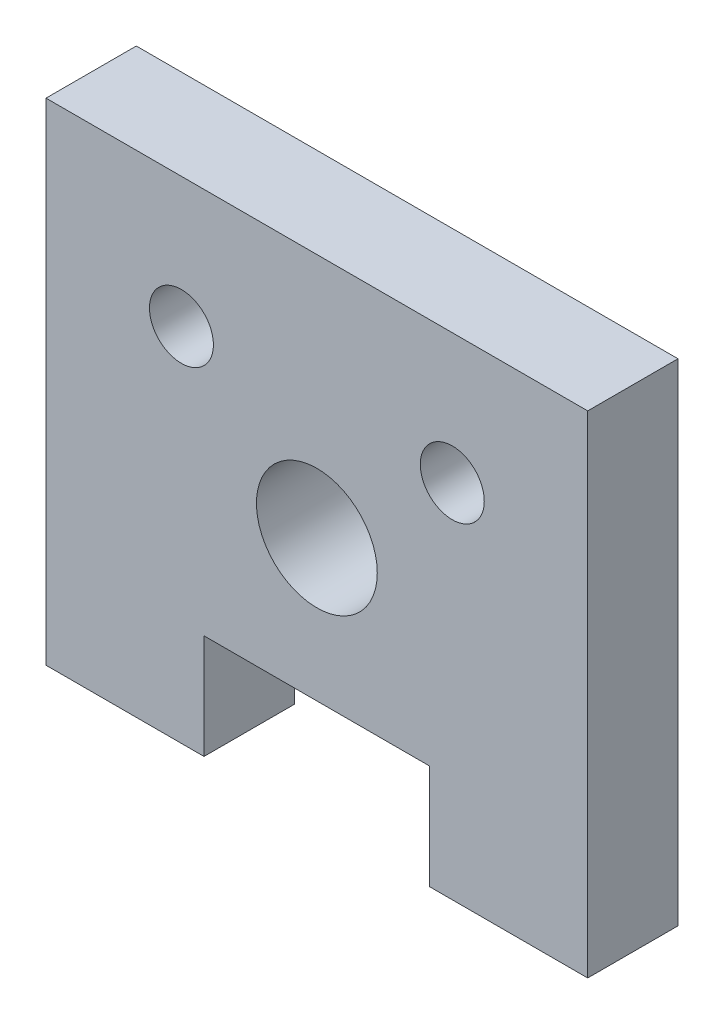
ISO-10303-21;
HEADER;
FILE_DESCRIPTION(('STEP AP214'),'2;1');
FILE_NAME('part.step','',(''),(''),'','','');
FILE_SCHEMA(('AUTOMOTIVE_DESIGN { 1 0 10303 214 1 1 1 1 }'));
ENDSEC;
DATA;
#1=APPLICATION_CONTEXT('core data for automotive mechanical design processes');
#2=APPLICATION_PROTOCOL_DEFINITION('international standard','automotive_design',2000,#1);
#3=PRODUCT_CONTEXT('',#1,'mechanical');
#4=PRODUCT('Part','Part','',(#3));
#5=PRODUCT_RELATED_PRODUCT_CATEGORY('part','',(#4));
#6=PRODUCT_DEFINITION_FORMATION('','',#4);
#7=PRODUCT_DEFINITION_CONTEXT('part definition',#1,'design');
#8=PRODUCT_DEFINITION('design','',#6,#7);
#9=PRODUCT_DEFINITION_SHAPE('','',#8);
#10=(LENGTH_UNIT() NAMED_UNIT(*) SI_UNIT(.MILLI.,.METRE.));
#11=(NAMED_UNIT(*) PLANE_ANGLE_UNIT() SI_UNIT($,.RADIAN.));
#12=(NAMED_UNIT(*) SI_UNIT($,.STERADIAN.) SOLID_ANGLE_UNIT());
#13=UNCERTAINTY_MEASURE_WITH_UNIT(LENGTH_MEASURE(1.E-05),#10,'distance_accuracy_value','');
#14=(GEOMETRIC_REPRESENTATION_CONTEXT(3) GLOBAL_UNCERTAINTY_ASSIGNED_CONTEXT((#13)) GLOBAL_UNIT_ASSIGNED_CONTEXT((#10,
#11,#12)) REPRESENTATION_CONTEXT('',''));
#15=CARTESIAN_POINT('',(0.,0.,0.));
#16=DIRECTION('',(0.,0.,1.));
#17=DIRECTION('',(1.,0.,0.));
#18=AXIS2_PLACEMENT_3D('',#15,#16,#17);
#19=CARTESIAN_POINT('',(0.,0.,12.7));
#20=DIRECTION('',(0.,0.,1.));
#21=DIRECTION('',(1.,0.,0.));
#22=AXIS2_PLACEMENT_3D('',#19,#20,#21);
#23=PLANE('',#22);
#24=CARTESIAN_POINT('',(19.05,16.256,12.7));
#25=DIRECTION('',(0.,0.,1.));
#26=DIRECTION('',(1.,0.,0.));
#27=AXIS2_PLACEMENT_3D('',#24,#25,#26);
#28=CIRCLE('',#27,4.5);
#29=CARTESIAN_POINT('',(23.55,16.256,12.7));
#30=VERTEX_POINT('',#29);
#31=EDGE_CURVE('E181',#30,#30,#28,.T.);
#32=ORIENTED_EDGE('',*,*,#31,.F.);
#33=EDGE_LOOP('',(#32));
#34=FACE_BOUND('',#33,.T.);
#35=DIRECTION('',(0.,-1.,0.));
#36=VECTOR('',#35,1.);
#37=CARTESIAN_POINT('',(-38.1,-34.544,12.7));
#38=LINE('',#37,#36);
#39=CARTESIAN_POINT('',(-38.1,34.544,12.7));
#40=VERTEX_POINT('',#39);
#41=CARTESIAN_POINT('',(-38.1,-34.544,12.7));
#42=VERTEX_POINT('',#41);
#43=EDGE_CURVE('E144',#40,#42,#38,.T.);
#44=ORIENTED_EDGE('',*,*,#43,.T.);
#45=DIRECTION('',(1.,0.,0.));
#46=VECTOR('',#45,1.);
#47=CARTESIAN_POINT('',(-15.875,-34.544,12.7));
#48=LINE('',#47,#46);
#49=CARTESIAN_POINT('',(-15.875,-34.544,12.7));
#50=VERTEX_POINT('',#49);
#51=EDGE_CURVE('E92',#42,#50,#48,.T.);
#52=ORIENTED_EDGE('',*,*,#51,.T.);
#53=DIRECTION('',(0.,1.,0.));
#54=VECTOR('',#53,1.);
#55=CARTESIAN_POINT('',(-15.875,-34.544,12.7));
#56=LINE('',#55,#54);
#57=CARTESIAN_POINT('',(-15.875,-19.844,12.7));
#58=VERTEX_POINT('',#57);
#59=EDGE_CURVE('E159',#50,#58,#56,.T.);
#60=ORIENTED_EDGE('',*,*,#59,.T.);
#61=DIRECTION('',(1.,0.,0.));
#62=VECTOR('',#61,1.);
#63=CARTESIAN_POINT('',(-15.875,-19.844,12.7));
#64=LINE('',#63,#62);
#65=CARTESIAN_POINT('',(15.875,-19.844,12.7));
#66=VERTEX_POINT('',#65);
#67=EDGE_CURVE('E172',#58,#66,#64,.T.);
#68=ORIENTED_EDGE('',*,*,#67,.T.);
#69=DIRECTION('',(0.,-1.,0.));
#70=VECTOR('',#69,1.);
#71=CARTESIAN_POINT('',(15.875,-19.844,12.7));
#72=LINE('',#71,#70);
#73=CARTESIAN_POINT('',(15.875,-34.544,12.7));
#74=VERTEX_POINT('',#73);
#75=EDGE_CURVE('E111',#66,#74,#72,.T.);
#76=ORIENTED_EDGE('',*,*,#75,.T.);
#77=DIRECTION('',(1.,0.,0.));
#78=VECTOR('',#77,1.);
#79=CARTESIAN_POINT('',(38.1,-34.544,12.7));
#80=LINE('',#79,#78);
#81=CARTESIAN_POINT('',(38.1,-34.544,12.7));
#82=VERTEX_POINT('',#81);
#83=EDGE_CURVE('E105',#74,#82,#80,.T.);
#84=ORIENTED_EDGE('',*,*,#83,.T.);
#85=DIRECTION('',(0.,1.,0.));
#86=VECTOR('',#85,1.);
#87=CARTESIAN_POINT('',(38.1,-34.544,12.7));
#88=LINE('',#87,#86);
#89=CARTESIAN_POINT('',(38.1,34.544,12.7));
#90=VERTEX_POINT('',#89);
#91=EDGE_CURVE('E109',#82,#90,#88,.T.);
#92=ORIENTED_EDGE('',*,*,#91,.T.);
#93=DIRECTION('',(-1.,0.,0.));
#94=VECTOR('',#93,1.);
#95=CARTESIAN_POINT('',(38.1,34.544,12.7));
#96=LINE('',#95,#94);
#97=EDGE_CURVE('E49',#90,#40,#96,.T.);
#98=ORIENTED_EDGE('',*,*,#97,.T.);
#99=EDGE_LOOP('',(#44,#52,#60,#68,#76,#84,#92,#98));
#100=FACE_BOUND('',#99,.T.);
#101=CARTESIAN_POINT('',(0.,0.,12.7));
#102=DIRECTION('',(0.,0.,1.));
#103=DIRECTION('',(1.,0.,0.));
#104=AXIS2_PLACEMENT_3D('',#101,#102,#103);
#105=CIRCLE('',#104,8.5);
#106=CARTESIAN_POINT('',(8.5,0.,12.7));
#107=VERTEX_POINT('',#106);
#108=EDGE_CURVE('E133',#107,#107,#105,.T.);
#109=ORIENTED_EDGE('',*,*,#108,.F.);
#110=EDGE_LOOP('',(#109));
#111=FACE_BOUND('',#110,.T.);
#112=CARTESIAN_POINT('',(-19.05,16.256,12.7));
#113=DIRECTION('',(0.,0.,1.));
#114=DIRECTION('',(1.,0.,0.));
#115=AXIS2_PLACEMENT_3D('',#112,#113,#114);
#116=CIRCLE('',#115,4.5);
#117=CARTESIAN_POINT('',(-14.55,16.256,12.7));
#118=VERTEX_POINT('',#117);
#119=EDGE_CURVE('E187',#118,#118,#116,.T.);
#120=ORIENTED_EDGE('',*,*,#119,.F.);
#121=EDGE_LOOP('',(#120));
#122=FACE_BOUND('',#121,.T.);
#123=ADVANCED_FACE('F32',(#34,#100,#111,#122),#23,.T.);
#124=CARTESIAN_POINT('',(0.,0.,0.));
#125=DIRECTION('',(0.,0.,1.));
#126=DIRECTION('',(1.,0.,0.));
#127=AXIS2_PLACEMENT_3D('',#124,#125,#126);
#128=PLANE('',#127);
#129=DIRECTION('',(0.,-1.,0.));
#130=VECTOR('',#129,1.);
#131=CARTESIAN_POINT('',(-38.1,-34.544,0.));
#132=LINE('',#131,#130);
#133=CARTESIAN_POINT('',(-38.1,34.544,0.));
#134=VERTEX_POINT('',#133);
#135=CARTESIAN_POINT('',(-38.1,-34.544,0.));
#136=VERTEX_POINT('',#135);
#137=EDGE_CURVE('E129',#134,#136,#132,.T.);
#138=ORIENTED_EDGE('',*,*,#137,.F.);
#139=DIRECTION('',(-1.,0.,0.));
#140=VECTOR('',#139,1.);
#141=CARTESIAN_POINT('',(38.1,34.544,0.));
#142=LINE('',#141,#140);
#143=CARTESIAN_POINT('',(38.1,34.544,0.));
#144=VERTEX_POINT('',#143);
#145=EDGE_CURVE('E84',#144,#134,#142,.T.);
#146=ORIENTED_EDGE('',*,*,#145,.F.);
#147=DIRECTION('',(0.,1.,0.));
#148=VECTOR('',#147,1.);
#149=CARTESIAN_POINT('',(38.1,-34.544,0.));
#150=LINE('',#149,#148);
#151=CARTESIAN_POINT('',(38.1,-34.544,0.));
#152=VERTEX_POINT('',#151);
#153=EDGE_CURVE('E78',#152,#144,#150,.T.);
#154=ORIENTED_EDGE('',*,*,#153,.F.);
#155=DIRECTION('',(1.,0.,0.));
#156=VECTOR('',#155,1.);
#157=CARTESIAN_POINT('',(38.1,-34.544,0.));
#158=LINE('',#157,#156);
#159=CARTESIAN_POINT('',(15.875,-34.544,0.));
#160=VERTEX_POINT('',#159);
#161=EDGE_CURVE('E119',#160,#152,#158,.T.);
#162=ORIENTED_EDGE('',*,*,#161,.F.);
#163=DIRECTION('',(0.,-1.,0.));
#164=VECTOR('',#163,1.);
#165=CARTESIAN_POINT('',(15.875,-19.844,0.));
#166=LINE('',#165,#164);
#167=CARTESIAN_POINT('',(15.875,-19.844,0.));
#168=VERTEX_POINT('',#167);
#169=EDGE_CURVE('E139',#168,#160,#166,.T.);
#170=ORIENTED_EDGE('',*,*,#169,.F.);
#171=DIRECTION('',(1.,0.,0.));
#172=VECTOR('',#171,1.);
#173=CARTESIAN_POINT('',(-15.875,-19.844,0.));
#174=LINE('',#173,#172);
#175=CARTESIAN_POINT('',(-15.875,-19.844,0.));
#176=VERTEX_POINT('',#175);
#177=EDGE_CURVE('E137',#176,#168,#174,.T.);
#178=ORIENTED_EDGE('',*,*,#177,.F.);
#179=DIRECTION('',(0.,1.,0.));
#180=VECTOR('',#179,1.);
#181=CARTESIAN_POINT('',(-15.875,-34.544,0.));
#182=LINE('',#181,#180);
#183=CARTESIAN_POINT('',(-15.875,-34.544,0.));
#184=VERTEX_POINT('',#183);
#185=EDGE_CURVE('E135',#184,#176,#182,.T.);
#186=ORIENTED_EDGE('',*,*,#185,.F.);
#187=DIRECTION('',(1.,0.,0.));
#188=VECTOR('',#187,1.);
#189=CARTESIAN_POINT('',(-15.875,-34.544,0.));
#190=LINE('',#189,#188);
#191=EDGE_CURVE('E132',#136,#184,#190,.T.);
#192=ORIENTED_EDGE('',*,*,#191,.F.);
#193=EDGE_LOOP('',(#138,#146,#154,#162,#170,#178,#186,#192));
#194=FACE_BOUND('',#193,.T.);
#195=CARTESIAN_POINT('',(0.,0.,0.));
#196=DIRECTION('',(0.,0.,1.));
#197=DIRECTION('',(1.,0.,0.));
#198=AXIS2_PLACEMENT_3D('',#195,#196,#197);
#199=CIRCLE('',#198,8.5);
#200=CARTESIAN_POINT('',(8.5,0.,0.));
#201=VERTEX_POINT('',#200);
#202=EDGE_CURVE('E178',#201,#201,#199,.T.);
#203=ORIENTED_EDGE('',*,*,#202,.T.);
#204=EDGE_LOOP('',(#203));
#205=FACE_BOUND('',#204,.T.);
#206=CARTESIAN_POINT('',(19.05,16.256,0.));
#207=DIRECTION('',(0.,0.,1.));
#208=DIRECTION('',(1.,0.,0.));
#209=AXIS2_PLACEMENT_3D('',#206,#207,#208);
#210=CIRCLE('',#209,4.5);
#211=CARTESIAN_POINT('',(23.55,16.256,0.));
#212=VERTEX_POINT('',#211);
#213=EDGE_CURVE('E184',#212,#212,#210,.T.);
#214=ORIENTED_EDGE('',*,*,#213,.T.);
#215=EDGE_LOOP('',(#214));
#216=FACE_BOUND('',#215,.T.);
#217=CARTESIAN_POINT('',(-19.05,16.256,0.));
#218=DIRECTION('',(0.,0.,1.));
#219=DIRECTION('',(1.,0.,0.));
#220=AXIS2_PLACEMENT_3D('',#217,#218,#219);
#221=CIRCLE('',#220,4.5);
#222=CARTESIAN_POINT('',(-14.55,16.256,0.));
#223=VERTEX_POINT('',#222);
#224=EDGE_CURVE('E190',#223,#223,#221,.T.);
#225=ORIENTED_EDGE('',*,*,#224,.T.);
#226=EDGE_LOOP('',(#225));
#227=FACE_BOUND('',#226,.T.);
#228=ADVANCED_FACE('F163',(#194,#205,#216,#227),#128,.F.);
#229=CARTESIAN_POINT('',(-38.1,-34.544,12.7));
#230=DIRECTION('',(1.,0.,0.));
#231=DIRECTION('',(0.,0.,-1.));
#232=AXIS2_PLACEMENT_3D('',#229,#230,#231);
#233=PLANE('',#232);
#234=ORIENTED_EDGE('',*,*,#137,.T.);
#235=DIRECTION('',(0.,0.,-1.));
#236=VECTOR('',#235,1.);
#237=CARTESIAN_POINT('',(-38.1,-34.544,12.7));
#238=LINE('',#237,#236);
#239=EDGE_CURVE('E11',#42,#136,#238,.T.);
#240=ORIENTED_EDGE('',*,*,#239,.F.);
#241=ORIENTED_EDGE('',*,*,#43,.F.);
#242=DIRECTION('',(0.,0.,-1.));
#243=VECTOR('',#242,1.);
#244=CARTESIAN_POINT('',(-38.1,34.544,12.7));
#245=LINE('',#244,#243);
#246=EDGE_CURVE('E125',#40,#134,#245,.T.);
#247=ORIENTED_EDGE('',*,*,#246,.T.);
#248=EDGE_LOOP('',(#234,#240,#241,#247));
#249=FACE_BOUND('',#248,.T.);
#250=ADVANCED_FACE('F34',(#249),#233,.F.);
#251=CARTESIAN_POINT('',(-15.875,-34.544,12.7));
#252=DIRECTION('',(0.,1.,0.));
#253=DIRECTION('',(0.,0.,1.));
#254=AXIS2_PLACEMENT_3D('',#251,#252,#253);
#255=PLANE('',#254);
#256=ORIENTED_EDGE('',*,*,#191,.T.);
#257=DIRECTION('',(0.,0.,-1.));
#258=VECTOR('',#257,1.);
#259=CARTESIAN_POINT('',(-15.875,-34.544,12.7));
#260=LINE('',#259,#258);
#261=EDGE_CURVE('E41',#50,#184,#260,.T.);
#262=ORIENTED_EDGE('',*,*,#261,.F.);
#263=ORIENTED_EDGE('',*,*,#51,.F.);
#264=ORIENTED_EDGE('',*,*,#239,.T.);
#265=EDGE_LOOP('',(#256,#262,#263,#264));
#266=FACE_BOUND('',#265,.T.);
#267=ADVANCED_FACE('F223',(#266),#255,.F.);
#268=CARTESIAN_POINT('',(-15.875,-34.544,12.7));
#269=DIRECTION('',(-1.,0.,0.));
#270=DIRECTION('',(0.,0.,1.));
#271=AXIS2_PLACEMENT_3D('',#268,#269,#270);
#272=PLANE('',#271);
#273=ORIENTED_EDGE('',*,*,#185,.T.);
#274=DIRECTION('',(0.,0.,-1.));
#275=VECTOR('',#274,1.);
#276=CARTESIAN_POINT('',(-15.875,-19.844,12.7));
#277=LINE('',#276,#275);
#278=EDGE_CURVE('E151',#58,#176,#277,.T.);
#279=ORIENTED_EDGE('',*,*,#278,.F.);
#280=ORIENTED_EDGE('',*,*,#59,.F.);
#281=ORIENTED_EDGE('',*,*,#261,.T.);
#282=EDGE_LOOP('',(#273,#279,#280,#281));
#283=FACE_BOUND('',#282,.T.);
#284=ADVANCED_FACE('F157',(#283),#272,.F.);
#285=CARTESIAN_POINT('',(-15.875,-19.844,12.7));
#286=DIRECTION('',(0.,1.,0.));
#287=DIRECTION('',(-1.,0.,0.));
#288=AXIS2_PLACEMENT_3D('',#285,#286,#287);
#289=PLANE('',#288);
#290=ORIENTED_EDGE('',*,*,#177,.T.);
#291=DIRECTION('',(0.,0.,-1.));
#292=VECTOR('',#291,1.);
#293=CARTESIAN_POINT('',(15.875,-19.844,12.7));
#294=LINE('',#293,#292);
#295=EDGE_CURVE('E148',#66,#168,#294,.T.);
#296=ORIENTED_EDGE('',*,*,#295,.F.);
#297=ORIENTED_EDGE('',*,*,#67,.F.);
#298=ORIENTED_EDGE('',*,*,#278,.T.);
#299=EDGE_LOOP('',(#290,#296,#297,#298));
#300=FACE_BOUND('',#299,.T.);
#301=ADVANCED_FACE('F168',(#300),#289,.F.);
#302=CARTESIAN_POINT('',(15.875,-19.844,12.7));
#303=DIRECTION('',(1.,0.,0.));
#304=DIRECTION('',(0.,0.,-1.));
#305=AXIS2_PLACEMENT_3D('',#302,#303,#304);
#306=PLANE('',#305);
#307=ORIENTED_EDGE('',*,*,#169,.T.);
#308=DIRECTION('',(0.,0.,-1.));
#309=VECTOR('',#308,1.);
#310=CARTESIAN_POINT('',(15.875,-34.544,12.7));
#311=LINE('',#310,#309);
#312=EDGE_CURVE('E120',#74,#160,#311,.T.);
#313=ORIENTED_EDGE('',*,*,#312,.F.);
#314=ORIENTED_EDGE('',*,*,#75,.F.);
#315=ORIENTED_EDGE('',*,*,#295,.T.);
#316=EDGE_LOOP('',(#307,#313,#314,#315));
#317=FACE_BOUND('',#316,.T.);
#318=ADVANCED_FACE('F171',(#317),#306,.F.);
#319=CARTESIAN_POINT('',(38.1,-34.544,12.7));
#320=DIRECTION('',(0.,1.,0.));
#321=DIRECTION('',(0.,0.,1.));
#322=AXIS2_PLACEMENT_3D('',#319,#320,#321);
#323=PLANE('',#322);
#324=ORIENTED_EDGE('',*,*,#161,.T.);
#325=DIRECTION('',(0.,0.,-1.));
#326=VECTOR('',#325,1.);
#327=CARTESIAN_POINT('',(38.1,-34.544,12.7));
#328=LINE('',#327,#326);
#329=EDGE_CURVE('E116',#82,#152,#328,.T.);
#330=ORIENTED_EDGE('',*,*,#329,.F.);
#331=ORIENTED_EDGE('',*,*,#83,.F.);
#332=ORIENTED_EDGE('',*,*,#312,.T.);
#333=EDGE_LOOP('',(#324,#330,#331,#332));
#334=FACE_BOUND('',#333,.T.);
#335=ADVANCED_FACE('F117',(#334),#323,.F.);
#336=CARTESIAN_POINT('',(38.1,-34.544,12.7));
#337=DIRECTION('',(-1.,0.,0.));
#338=DIRECTION('',(0.,0.,1.));
#339=AXIS2_PLACEMENT_3D('',#336,#337,#338);
#340=PLANE('',#339);
#341=ORIENTED_EDGE('',*,*,#153,.T.);
#342=DIRECTION('',(0.,0.,-1.));
#343=VECTOR('',#342,1.);
#344=CARTESIAN_POINT('',(38.1,34.544,12.7));
#345=LINE('',#344,#343);
#346=EDGE_CURVE('E121',#90,#144,#345,.T.);
#347=ORIENTED_EDGE('',*,*,#346,.F.);
#348=ORIENTED_EDGE('',*,*,#91,.F.);
#349=ORIENTED_EDGE('',*,*,#329,.T.);
#350=EDGE_LOOP('',(#341,#347,#348,#349));
#351=FACE_BOUND('',#350,.T.);
#352=ADVANCED_FACE('F123',(#351),#340,.F.);
#353=CARTESIAN_POINT('',(38.1,34.544,12.7));
#354=DIRECTION('',(0.,-1.,0.));
#355=DIRECTION('',(0.,0.,-1.));
#356=AXIS2_PLACEMENT_3D('',#353,#354,#355);
#357=PLANE('',#356);
#358=ORIENTED_EDGE('',*,*,#145,.T.);
#359=ORIENTED_EDGE('',*,*,#246,.F.);
#360=ORIENTED_EDGE('',*,*,#97,.F.);
#361=ORIENTED_EDGE('',*,*,#346,.T.);
#362=EDGE_LOOP('',(#358,#359,#360,#361));
#363=FACE_BOUND('',#362,.T.);
#364=ADVANCED_FACE('F211',(#363),#357,.F.);
#365=CARTESIAN_POINT('',(0.,0.,12.7));
#366=DIRECTION('',(0.,0.,-1.));
#367=DIRECTION('',(-1.,0.,0.));
#368=AXIS2_PLACEMENT_3D('',#365,#366,#367);
#369=CYLINDRICAL_SURFACE('',#368,8.5);
#370=ORIENTED_EDGE('',*,*,#108,.T.);
#371=EDGE_LOOP('',(#370));
#372=FACE_BOUND('',#371,.T.);
#373=ORIENTED_EDGE('',*,*,#202,.F.);
#374=EDGE_LOOP('',(#373));
#375=FACE_BOUND('',#374,.T.);
#376=ADVANCED_FACE('F208',(#372,#375),#369,.F.);
#377=CARTESIAN_POINT('',(19.05,16.256,12.7));
#378=DIRECTION('',(0.,0.,-1.));
#379=DIRECTION('',(-1.,0.,0.));
#380=AXIS2_PLACEMENT_3D('',#377,#378,#379);
#381=CYLINDRICAL_SURFACE('',#380,4.5);
#382=ORIENTED_EDGE('',*,*,#31,.T.);
#383=EDGE_LOOP('',(#382));
#384=FACE_BOUND('',#383,.T.);
#385=ORIENTED_EDGE('',*,*,#213,.F.);
#386=EDGE_LOOP('',(#385));
#387=FACE_BOUND('',#386,.T.);
#388=ADVANCED_FACE('F287',(#384,#387),#381,.F.);
#389=CARTESIAN_POINT('',(-19.05,16.256,12.7));
#390=DIRECTION('',(0.,0.,-1.));
#391=DIRECTION('',(-1.,0.,0.));
#392=AXIS2_PLACEMENT_3D('',#389,#390,#391);
#393=CYLINDRICAL_SURFACE('',#392,4.5);
#394=ORIENTED_EDGE('',*,*,#119,.T.);
#395=EDGE_LOOP('',(#394));
#396=FACE_BOUND('',#395,.T.);
#397=ORIENTED_EDGE('',*,*,#224,.F.);
#398=EDGE_LOOP('',(#397));
#399=FACE_BOUND('',#398,.T.);
#400=ADVANCED_FACE('F196',(#396,#399),#393,.F.);
#401=CLOSED_SHELL('',(#123,#228,#250,#267,#284,#301,#318,#335,#352,#364,#376,#388,#400));
#402=MANIFOLD_SOLID_BREP('B2',#401);
#403=ADVANCED_BREP_SHAPE_REPRESENTATION('',(#18,#402),#14);
#404=SHAPE_DEFINITION_REPRESENTATION(#9,#403);
ENDSEC;
END-ISO-10303-21;
